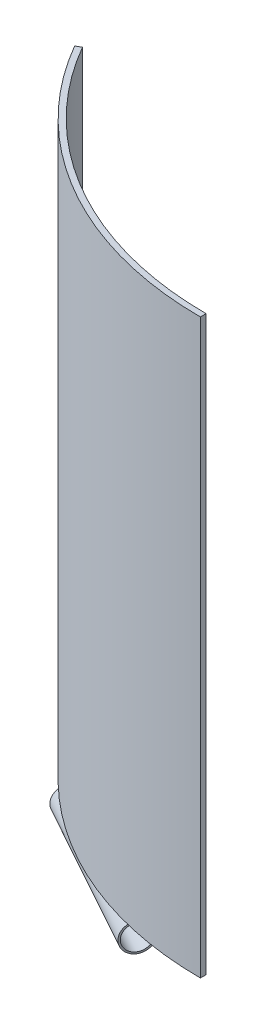
ISO-10303-21;
HEADER;
FILE_DESCRIPTION(('STEP AP214'),'2;1');
FILE_NAME('part.step','',(''),(''),'','','');
FILE_SCHEMA(('AUTOMOTIVE_DESIGN { 1 0 10303 214 1 1 1 1 }'));
ENDSEC;
DATA;
#1=APPLICATION_CONTEXT('core data for automotive mechanical design processes');
#2=APPLICATION_PROTOCOL_DEFINITION('international standard','automotive_design',2000,#1);
#3=PRODUCT_CONTEXT('',#1,'mechanical');
#4=PRODUCT('Part','Part','',(#3));
#5=PRODUCT_RELATED_PRODUCT_CATEGORY('part','',(#4));
#6=PRODUCT_DEFINITION_FORMATION('','',#4);
#7=PRODUCT_DEFINITION_CONTEXT('part definition',#1,'design');
#8=PRODUCT_DEFINITION('design','',#6,#7);
#9=PRODUCT_DEFINITION_SHAPE('','',#8);
#10=(LENGTH_UNIT() NAMED_UNIT(*) SI_UNIT(.MILLI.,.METRE.));
#11=(NAMED_UNIT(*) PLANE_ANGLE_UNIT() SI_UNIT($,.RADIAN.));
#12=(NAMED_UNIT(*) SI_UNIT($,.STERADIAN.) SOLID_ANGLE_UNIT());
#13=UNCERTAINTY_MEASURE_WITH_UNIT(LENGTH_MEASURE(1.E-05),#10,'distance_accuracy_value','');
#14=(GEOMETRIC_REPRESENTATION_CONTEXT(3) GLOBAL_UNCERTAINTY_ASSIGNED_CONTEXT((#13)) GLOBAL_UNIT_ASSIGNED_CONTEXT((#10,
#11,#12)) REPRESENTATION_CONTEXT('',''));
#15=CARTESIAN_POINT('',(0.,0.,0.));
#16=DIRECTION('',(0.,0.,1.));
#17=DIRECTION('',(1.,0.,0.));
#18=AXIS2_PLACEMENT_3D('',#15,#16,#17);
#19=CARTESIAN_POINT('',(-18.0124008718876,-3.175,72.1702526452258));
#20=DIRECTION('',(-0.875062045820491,0.,-0.484010760174252));
#21=DIRECTION('',(-0.484010760174252,0.,0.875062045820491));
#22=AXIS2_PLACEMENT_3D('',#19,#20,#21);
#23=CYLINDRICAL_SURFACE('',#22,3.175);
#24=CARTESIAN_POINT('',(-18.0124008718876,-3.175,72.1702526452258));
#25=DIRECTION('',(0.875062045820491,0.,0.484010760174252));
#26=DIRECTION('',(0.484010760174252,0.,-0.875062045820491));
#27=AXIS2_PLACEMENT_3D('',#24,#25,#26);
#28=CIRCLE('',#27,3.175);
#29=CARTESIAN_POINT('',(-16.4756667083344,-3.175,69.3919306497457));
#30=VERTEX_POINT('',#29);
#31=EDGE_CURVE('E11',#30,#30,#28,.T.);
#32=ORIENTED_EDGE('',*,*,#31,.F.);
#33=EDGE_LOOP('',(#32));
#34=FACE_BOUND('',#33,.T.);
#35=CARTESIAN_POINT('',(-51.7967963369251,-3.175,53.4835652164183));
#36=DIRECTION('',(0.875062045820491,0.,0.484010760174252));
#37=DIRECTION('',(0.484010760174252,0.,-0.875062045820491));
#38=AXIS2_PLACEMENT_3D('',#35,#36,#37);
#39=CIRCLE('',#38,3.175);
#40=CARTESIAN_POINT('',(-50.2600621733719,-3.175,50.7052432209382));
#41=VERTEX_POINT('',#40);
#42=EDGE_CURVE('E60',#41,#41,#39,.T.);
#43=ORIENTED_EDGE('',*,*,#42,.T.);
#44=EDGE_LOOP('',(#43));
#45=FACE_BOUND('',#44,.T.);
#46=ADVANCED_FACE('F54',(#34,#45),#23,.T.);
#47=CARTESIAN_POINT('',(-18.0124008718876,-3.175,72.1702526452258));
#48=DIRECTION('',(0.875062045820491,0.,0.484010760174252));
#49=DIRECTION('',(0.484010760174252,0.,-0.875062045820491));
#50=AXIS2_PLACEMENT_3D('',#47,#48,#49);
#51=PLANE('',#50);
#52=CARTESIAN_POINT('',(-18.0124008718876,-3.175,72.1702526452258));
#53=DIRECTION('',(0.875062045820491,0.,0.484010760174252));
#54=DIRECTION('',(0.484010760174252,0.,-0.875062045820491));
#55=AXIS2_PLACEMENT_3D('',#52,#53,#54);
#56=CIRCLE('',#55,2.79400000000002);
#57=CARTESIAN_POINT('',(-16.6600748079607,-3.175,69.7253292892033));
#58=VERTEX_POINT('',#57);
#59=EDGE_CURVE('E64',#58,#58,#56,.T.);
#60=ORIENTED_EDGE('',*,*,#59,.F.);
#61=EDGE_LOOP('',(#60));
#62=FACE_BOUND('',#61,.T.);
#63=ORIENTED_EDGE('',*,*,#31,.T.);
#64=EDGE_LOOP('',(#63));
#65=FACE_BOUND('',#64,.T.);
#66=ADVANCED_FACE('F79',(#62,#65),#51,.T.);
#67=CARTESIAN_POINT('',(-51.7967963369251,-3.175,53.4835652164183));
#68=DIRECTION('',(0.875062045820491,0.,0.484010760174252));
#69=DIRECTION('',(0.484010760174252,0.,-0.875062045820491));
#70=AXIS2_PLACEMENT_3D('',#67,#68,#69);
#71=PLANE('',#70);
#72=CARTESIAN_POINT('',(-51.7967963369251,-3.175,53.4835652164182));
#73=DIRECTION('',(-0.875062045820491,0.,-0.484010760174252));
#74=DIRECTION('',(-0.484010760174252,0.,0.875062045820491));
#75=AXIS2_PLACEMENT_3D('',#72,#73,#74);
#76=CIRCLE('',#75,2.79400000000002);
#77=CARTESIAN_POINT('',(-53.149122400852,-3.175,55.9284885724407));
#78=VERTEX_POINT('',#77);
#79=EDGE_CURVE('E68',#78,#78,#76,.T.);
#80=ORIENTED_EDGE('',*,*,#79,.F.);
#81=EDGE_LOOP('',(#80));
#82=FACE_BOUND('',#81,.T.);
#83=ORIENTED_EDGE('',*,*,#42,.F.);
#84=EDGE_LOOP('',(#83));
#85=FACE_BOUND('',#84,.T.);
#86=ADVANCED_FACE('F76',(#82,#85),#71,.F.);
#87=CARTESIAN_POINT('',(-14.0116171983963,-3.175,74.3831498407425));
#88=DIRECTION('',(-0.875062045820491,0.,-0.484010760174252));
#89=DIRECTION('',(-0.484010760174252,0.,0.875062045820491));
#90=AXIS2_PLACEMENT_3D('',#87,#88,#89);
#91=CYLINDRICAL_SURFACE('',#90,2.79400000000002);
#92=ORIENTED_EDGE('',*,*,#59,.T.);
#93=EDGE_LOOP('',(#92));
#94=FACE_BOUND('',#93,.T.);
#95=ORIENTED_EDGE('',*,*,#79,.T.);
#96=EDGE_LOOP('',(#95));
#97=FACE_BOUND('',#96,.T.);
#98=ADVANCED_FACE('F74',(#94,#97),#91,.F.);
#99=CLOSED_SHELL('',(#46,#66,#86,#98));
#100=MANIFOLD_SOLID_BREP('B2',#99);
#101=CARTESIAN_POINT('',(0.,25.4,0.));
#102=DIRECTION('',(0.,-1.,0.));
#103=DIRECTION('',(0.,0.,-1.));
#104=AXIS2_PLACEMENT_3D('',#101,#102,#103);
#105=CYLINDRICAL_SURFACE('',#104,71.12);
#106=DIRECTION('',(0.,-1.,0.));
#107=VECTOR('',#106,1.);
#108=CARTESIAN_POINT('',(-49.3573665216638,25.4,51.2045385688235));
#109=LINE('',#108,#107);
#110=CARTESIAN_POINT('',(-49.3573665216638,6.35,51.2045385688235));
#111=VERTEX_POINT('',#110);
#112=CARTESIAN_POINT('',(-49.3573665216638,0.,51.2045385688235));
#113=VERTEX_POINT('',#112);
#114=EDGE_CURVE('E195',#111,#113,#109,.T.);
#115=ORIENTED_EDGE('',*,*,#114,.F.);
#116=CARTESIAN_POINT('',(-49.3573665216638,6.35,51.2045385688235));
#117=CARTESIAN_POINT('',(-49.3573652597534,6.61771881219116,51.2045367891355));
#118=CARTESIAN_POINT('',(-49.3533029948045,6.8854078913629,51.2084558700492));
#119=CARTESIAN_POINT('',(-49.3370553186476,7.42030407676832,51.2241110994516));
#120=CARTESIAN_POINT('',(-49.324870102378,7.68751119441404,51.2358470603472));
#121=CARTESIAN_POINT('',(-49.2761363077966,8.4876591517723,51.2827355972177));
#122=CARTESIAN_POINT('',(-49.2274095832751,9.01926351451726,51.329568852524));
#123=CARTESIAN_POINT('',(-49.0975842620489,10.0746048855446,51.4537624096006));
#124=CARTESIAN_POINT('',(-49.016503112022,10.5983459763078,51.5311062586975));
#125=CARTESIAN_POINT('',(-48.8707528105034,11.3753416973957,51.6692201848417));
#126=CARTESIAN_POINT('',(-48.8181453332973,11.6329145215676,51.718943641989));
#127=CARTESIAN_POINT('',(-48.7048914111563,12.1448493310039,51.825611522175));
#128=CARTESIAN_POINT('',(-48.6442428935718,12.3992104698512,51.8825578067969));
#129=CARTESIAN_POINT('',(-48.4502480766987,13.1568632053012,52.0639928733405));
#130=CARTESIAN_POINT('',(-48.304869102134,13.6546354517401,52.1990620469349));
#131=CARTESIAN_POINT('',(-47.9823743262475,14.6316727443776,52.4956577484358));
#132=CARTESIAN_POINT('',(-47.8052586651772,15.1109378723519,52.6571841594214));
#133=CARTESIAN_POINT('',(-47.5161705812211,15.8132665488478,52.9177164706716));
#134=CARTESIAN_POINT('',(-47.4158982827076,16.0446288917426,53.0076073648309));
#135=CARTESIAN_POINT('',(-47.207629914459,16.5014004255731,53.1931718767468));
#136=CARTESIAN_POINT('',(-47.0996358263075,16.7268111236471,53.2888440099393));
#137=CARTESIAN_POINT('',(-46.7641188005348,17.3936255921992,53.5841431133983));
#138=CARTESIAN_POINT('',(-46.5250409215741,17.8256608665121,53.7920710701712));
#139=CARTESIAN_POINT('',(-46.0177236597758,18.6600750223687,54.2266973216519));
#140=CARTESIAN_POINT('',(-45.7495741583235,19.0625392016036,54.4533372735829));
#141=CARTESIAN_POINT('',(-45.1844597727074,19.8364124210124,54.9231641928396));
#142=CARTESIAN_POINT('',(-44.8874948971022,20.2078214704099,55.1663511552507));
#143=CARTESIAN_POINT('',(-44.2659673024639,20.9169026288164,55.6663054862512));
#144=CARTESIAN_POINT('',(-43.9414035562595,21.2545734811434,55.9230733601587));
#145=CARTESIAN_POINT('',(-43.2661882379939,21.8937655989848,56.4470896434286));
#146=CARTESIAN_POINT('',(-42.91553696729,22.1952872819814,56.7143379317067));
#147=CARTESIAN_POINT('',(-42.1944141079172,22.7566285805899,57.2528233900256));
#148=CARTESIAN_POINT('',(-41.8242393439033,23.0169154959907,57.5239710705038));
#149=CARTESIAN_POINT('',(-41.0622259046606,23.4985482722169,58.0703690963133));
#150=CARTESIAN_POINT('',(-40.6703874567389,23.7198945415268,58.3456193985756));
#151=CARTESIAN_POINT('',(-39.867395917458,24.122359181542,58.8972185455002));
#152=CARTESIAN_POINT('',(-39.4562452333284,24.3034825499111,59.173567249339));
#153=CARTESIAN_POINT('',(-38.6171261082675,24.6246845306415,59.7245668292002));
#154=CARTESIAN_POINT('',(-38.1891576232063,24.7647630352931,59.9992177007653));
#155=CARTESIAN_POINT('',(-37.3201455027519,25.0031637126344,60.5435661680649));
#156=CARTESIAN_POINT('',(-36.8791341640675,25.101581074304,60.8132736935948));
#157=CARTESIAN_POINT('',(-35.9859646458794,25.2570894844094,61.3460279392192));
#158=CARTESIAN_POINT('',(-35.5338065287228,25.3141807639401,61.6090746965526));
#159=CARTESIAN_POINT('',(-34.6212499607361,25.3873695055246,62.1264725361366));
#160=CARTESIAN_POINT('',(-34.1608509471373,25.4034641570908,62.3808230210427));
#161=CARTESIAN_POINT('',(-33.2348008314919,25.395295565324,62.8790816625221));
#162=CARTESIAN_POINT('',(-32.7691495828241,25.371031192547,63.1229895266637));
#163=CARTESIAN_POINT('',(-31.8180367364146,25.2813848717686,63.6078802219447));
#164=CARTESIAN_POINT('',(-31.3324867505585,25.2144959745294,63.8484108212909));
#165=CARTESIAN_POINT('',(-30.3621318918661,25.0394440661332,64.3155140193914));
#166=CARTESIAN_POINT('',(-29.8773270355771,24.9312801512981,64.5420863124155));
#167=CARTESIAN_POINT('',(-28.9113593669887,24.674957648434,64.9805292848114));
#168=CARTESIAN_POINT('',(-28.4301985513847,24.5267785644608,65.1923923599542));
#169=CARTESIAN_POINT('',(-27.4748315562922,24.1918651116405,65.6007466369491));
#170=CARTESIAN_POINT('',(-27.0006256048801,24.0051294813914,65.7972373355941));
#171=CARTESIAN_POINT('',(-26.0281412148589,23.5796355239507,66.1882498468881));
#172=CARTESIAN_POINT('',(-25.5306092197533,23.338087552931,66.3815966879089));
#173=CARTESIAN_POINT('',(-24.5506476954266,22.8139900870095,66.7502376185596));
#174=CARTESIAN_POINT('',(-24.0682193623018,22.5314373547745,66.925530280939));
#175=CARTESIAN_POINT('',(-23.122460158976,21.9271761674338,67.2581399862353));
#176=CARTESIAN_POINT('',(-22.6591189641452,21.60548926322,67.4154668310728));
#177=CARTESIAN_POINT('',(-21.7550710063113,20.9244519445069,67.7126106705241));
#178=CARTESIAN_POINT('',(-21.3143623094836,20.5651047558801,67.8524291626054));
#179=CARTESIAN_POINT('',(-20.5314600397134,19.8738413018054,68.0929656305183));
#180=CARTESIAN_POINT('',(-20.1851603848944,19.5474699510449,68.1963053176427));
#181=CARTESIAN_POINT('',(-19.5134566707862,18.8707898887676,68.3915323688647));
#182=CARTESIAN_POINT('',(-19.1880480728731,18.5204864109221,68.4834222245706));
#183=CARTESIAN_POINT('',(-18.5605261837878,17.7968093512954,68.6561517195612));
#184=CARTESIAN_POINT('',(-18.2584198008984,17.4234289866787,68.7369880873247));
#185=CARTESIAN_POINT('',(-17.6802043724938,16.6547325871741,68.8879838209757));
#186=CARTESIAN_POINT('',(-17.4041080803343,16.2594059409373,68.9581379593996));
#187=CARTESIAN_POINT('',(-17.1424639872496,15.8538097624071,69.023114450493));
#188=B_SPLINE_CURVE_WITH_KNOTS('',3,(#116,#117,#118,#119,#120,#121,#122,#123,#124,#125,#126,
#127,#128,#129,#130,#131,#132,#133,#134,#135,#136,#137,#138,#139,#140,#141,#142,#143,#144,#145,
#146,#147,#148,#149,#150,#151,#152,#153,#154,#155,#156,#157,#158,#159,#160,#161,#162,#163,#164,
#165,#166,#167,#168,#169,#170,#171,#172,#173,#174,#175,#176,#177,#178,#179,#180,#181,#182,#183,
#184,#185,#186,#187),.UNSPECIFIED.,.F.,.F.,(4,2,2,2,2,2,2,2,2,2,2,2,2,2,2,2,2,2,2,2,2,2,2,2,2,2,
2,2,2,2,2,2,2,2,2,4),(0.,0.803037585384164,1.60605589978929,3.21168310578875,4.81644566694522,
5.61889181597041,6.42154520620336,8.02712584734719,9.63269939323942,10.4355890131522,
11.238273328075,12.8434739909355,14.4438461897658,16.0442179132727,17.6446492253007,
19.2450620523656,20.8257906617084,22.4065026883384,23.9870182027175,25.5675378646422,
27.1444265435826,28.721306404519,30.2982943641565,31.8753264564213,33.5114636209979,
35.1476366093224,36.7846492473836,38.4217154498414,40.1774379460169,41.9332991322855,
43.6881977193716,45.4429461095222,46.9026882221883,48.3621121222156,49.8219670399777,
51.2825340732286),.UNSPECIFIED.);
#189=CARTESIAN_POINT('',(-34.4228452635928,25.3891523351977,62.2344126987533));
#190=VERTEX_POINT('',#189);
#191=EDGE_CURVE('E223',#111,#190,#188,.T.);
#192=ORIENTED_EDGE('',*,*,#191,.T.);
#193=CARTESIAN_POINT('',(-49.3573665216638,15.8538097624073,51.2045385688235));
#194=CARTESIAN_POINT('',(-49.1220348464051,16.3455845134195,51.4313979030367));
#195=CARTESIAN_POINT('',(-48.8689822632921,16.8222185699394,51.6721786856272));
#196=CARTESIAN_POINT('',(-48.3296043491767,17.7428270232079,52.1770021549655));
#197=CARTESIAN_POINT('',(-48.0432987301324,18.1868205164982,52.4410310383192));
#198=CARTESIAN_POINT('',(-47.4397833741944,19.0396736148463,52.9876113312744));
#199=CARTESIAN_POINT('',(-47.1226236807349,19.4485881532959,53.2701325117534));
#200=CARTESIAN_POINT('',(-46.4587872345089,20.2304156790268,53.8500669424058));
#201=CARTESIAN_POINT('',(-46.1121058284715,20.603322970934,54.1474825372118));
#202=CARTESIAN_POINT('',(-45.3917574361727,21.3106913958299,54.7527498251932));
#203=CARTESIAN_POINT('',(-45.0181471056079,21.6452296181641,55.0605789243974));
#204=CARTESIAN_POINT('',(-44.2450379133439,22.2751228808109,55.6837274767687));
#205=CARTESIAN_POINT('',(-43.8455388588784,22.570477629315,55.9990469856981));
#206=CARTESIAN_POINT('',(-43.0222154753056,23.1204907867591,56.6340336655559));
#207=CARTESIAN_POINT('',(-42.5983773731945,23.3751258385399,56.9537032184516));
#208=CARTESIAN_POINT('',(-41.7285383273601,23.8417670145723,57.5940548933133));
#209=CARTESIAN_POINT('',(-41.2825366157438,24.0537716605405,57.9147370500015));
#210=CARTESIAN_POINT('',(-40.3529142459724,24.4407180028111,58.566468391526));
#211=CARTESIAN_POINT('',(-39.8685056065112,24.61390610502,58.8974380270927));
#212=CARTESIAN_POINT('',(-38.8810286919337,24.9103586589151,59.5539378525337));
#213=CARTESIAN_POINT('',(-38.3779598415686,25.0336215701309,59.8794678742685));
#214=CARTESIAN_POINT('',(-37.356709134658,25.2282827279063,60.521850702976));
#215=CARTESIAN_POINT('',(-36.8385329537241,25.2997001974294,60.8387066840859));
#216=CARTESIAN_POINT('',(-35.7907873795517,25.3890572072093,61.4609230289271));
#217=CARTESIAN_POINT('',(-35.2612187865759,25.4070004914975,61.7662841959975));
#218=CARTESIAN_POINT('',(-34.2241016807465,25.3886129928538,62.3466036621565));
#219=CARTESIAN_POINT('',(-33.7169211168198,25.3551796436685,62.6223123096598));
#220=CARTESIAN_POINT('',(-32.7004789092278,25.238608530625,63.1590319898167));
#221=CARTESIAN_POINT('',(-32.1912173268848,25.1554722210425,63.4200434522557));
#222=CARTESIAN_POINT('',(-31.1753055422593,24.9393075052687,63.9255547421498));
#223=CARTESIAN_POINT('',(-30.6686544974504,24.8062963707171,64.1700602510634));
#224=CARTESIAN_POINT('',(-29.6625691414109,24.4907111875008,64.6412787461068));
#225=CARTESIAN_POINT('',(-29.1631344394462,24.3081398329825,64.8679926985412));
#226=CARTESIAN_POINT('',(-28.2106403118764,23.9087352536194,65.2875640370276));
#227=CARTESIAN_POINT('',(-27.7567668988568,23.6951565308815,65.4816790280873));
#228=CARTESIAN_POINT('',(-26.8635021011404,23.2271081387573,65.8531747403246));
#229=CARTESIAN_POINT('',(-26.4241099855863,22.9726405368144,66.0305563068665));
#230=CARTESIAN_POINT('',(-25.5637463485102,22.424477971972,66.368387774179));
#231=CARTESIAN_POINT('',(-25.1427728980054,22.1307871300326,66.52883945051));
#232=CARTESIAN_POINT('',(-24.3229477856515,21.5061811268914,66.8329244747342));
#233=CARTESIAN_POINT('',(-23.9240960799415,21.1752660394985,66.9765578559738));
#234=CARTESIAN_POINT('',(-23.1611748474643,20.4868070115378,67.2441370906602));
#235=CARTESIAN_POINT('',(-22.7965069609339,20.1300748785515,67.3684672844508));
#236=CARTESIAN_POINT('',(-22.0947181350669,19.3858663829899,67.601883198097));
#237=CARTESIAN_POINT('',(-21.7575967391085,18.9983905302452,67.7109691706684));
#238=CARTESIAN_POINT('',(-21.1136686725999,18.195343359829,67.9145159052618));
#239=CARTESIAN_POINT('',(-20.806865842219,17.7797684943171,68.0089748154674));
#240=CARTESIAN_POINT('',(-20.2261610949377,16.9234638394843,68.1839335916176));
#241=CARTESIAN_POINT('',(-19.9522590427855,16.4827341535835,68.2644335149468));
#242=CARTESIAN_POINT('',(-19.4370694997141,15.5747052268208,68.4129179543814));
#243=CARTESIAN_POINT('',(-19.1961306713216,15.1071866441386,68.4807710738696));
#244=CARTESIAN_POINT('',(-18.7520892310695,14.1528608678235,68.6036926929827));
#245=CARTESIAN_POINT('',(-18.5489894950116,13.6660522115362,68.6587602209707));
#246=CARTESIAN_POINT('',(-18.1824315902222,12.6768285273353,68.7567421978716));
#247=CARTESIAN_POINT('',(-18.0189525332701,12.1744218810631,68.799663052582));
#248=CARTESIAN_POINT('',(-17.732897980824,11.1574662592318,68.8739465640259));
#249=CARTESIAN_POINT('',(-17.6103111531603,10.6429206900376,68.9053124231642));
#250=CARTESIAN_POINT('',(-17.3869805049607,9.50277031673198,68.9620430536867));
#251=CARTESIAN_POINT('',(-17.2952791489143,8.87523223626952,68.9850130655464));
#252=CARTESIAN_POINT('',(-17.2035997612933,7.9300320097593,69.0079080807862));
#253=CARTESIAN_POINT('',(-17.1806854399629,7.6145504517821,69.0136131281824));
#254=CARTESIAN_POINT('',(-17.1501162329874,6.98273281605173,69.021214565586));
#255=CARTESIAN_POINT('',(-17.1424647370855,6.66639656409569,69.0231101095358));
#256=CARTESIAN_POINT('',(-17.1424639872496,6.35,69.023114450493));
#257=B_SPLINE_CURVE_WITH_KNOTS('',3,(#193,#194,#195,#196,#197,#198,#199,#200,#201,#202,#203,
#204,#205,#206,#207,#208,#209,#210,#211,#212,#213,#214,#215,#216,#217,#218,#219,#220,#221,#222,
#223,#224,#225,#226,#227,#228,#229,#230,#231,#232,#233,#234,#235,#236,#237,#238,#239,#240,#241,
#242,#243,#244,#245,#246,#247,#248,#249,#250,#251,#252,#253,#254,#255,#256),.UNSPECIFIED.,.F.,
.F.,(4,2,2,2,2,2,2,2,2,2,2,2,2,2,2,2,2,2,2,2,2,2,2,2,2,2,2,2,2,2,2,4),(0.,1.77058929703553,
3.54013431824873,5.306855636135,7.07385594542077,8.83724147279899,10.6006401317773,
12.365046690606,14.1295144227543,15.9623244882917,17.7951911019293,19.6273777879329,
21.4594361891229,23.1918997628961,24.9243126484147,26.6561261530093,28.3878455332234,
29.9994591707267,31.6109913466663,33.2223543411936,34.8337141407408,36.4070817004496,
37.9804231740766,39.5539636734181,41.1274977038689,42.7165655825886,44.3057541825399,
45.8941031228239,47.4820115289956,49.3823284016655,50.3310888257954,51.2800599380771),.UNSPECIFIED.);
#258=CARTESIAN_POINT('',(-17.1424639872496,6.35,69.023114450493));
#259=VERTEX_POINT('',#258);
#260=EDGE_CURVE('E216',#190,#259,#257,.T.);
#261=ORIENTED_EDGE('',*,*,#260,.T.);
#262=DIRECTION('',(0.,-1.,0.));
#263=VECTOR('',#262,1.);
#264=CARTESIAN_POINT('',(-17.1424639872496,25.4,69.023114450493));
#265=LINE('',#264,#263);
#266=CARTESIAN_POINT('',(-17.1424639872496,0.,69.023114450493));
#267=VERTEX_POINT('',#266);
#268=EDGE_CURVE('E202',#259,#267,#265,.T.);
#269=ORIENTED_EDGE('',*,*,#268,.T.);
#270=CARTESIAN_POINT('',(0.,0.,0.));
#271=DIRECTION('',(0.,1.,0.));
#272=DIRECTION('',(1.,0.,0.));
#273=AXIS2_PLACEMENT_3D('',#270,#271,#272);
#274=CIRCLE('',#273,71.12);
#275=EDGE_CURVE('E186',#267,#113,#274,.F.);
#276=ORIENTED_EDGE('',*,*,#275,.T.);
#277=EDGE_LOOP('',(#115,#192,#261,#269,#276));
#278=FACE_BOUND('',#277,.T.);
#279=ADVANCED_FACE('F125',(#278),#105,.F.);
#280=CARTESIAN_POINT('',(-52.001511156753,25.4,53.9476388492962));
#281=DIRECTION('',(-0.719973826895723,0.,-0.694001216558824));
#282=DIRECTION('',(-0.694001216558824,0.,0.719973826895723));
#283=AXIS2_PLACEMENT_3D('',#280,#281,#282);
#284=PLANE('',#283);
#285=DIRECTION('',(0.,-1.,0.));
#286=VECTOR('',#285,1.);
#287=CARTESIAN_POINT('',(-52.001511156753,25.4,53.9476388492962));
#288=LINE('',#287,#286);
#289=CARTESIAN_POINT('',(-52.001511156753,6.35,53.9476388492962));
#290=VERTEX_POINT('',#289);
#291=CARTESIAN_POINT('',(-52.001511156753,0.,53.9476388492962));
#292=VERTEX_POINT('',#291);
#293=EDGE_CURVE('E200',#290,#292,#288,.T.);
#294=ORIENTED_EDGE('',*,*,#293,.F.);
#295=DIRECTION('',(0.694001216558824,0.,-0.719973826895723));
#296=VECTOR('',#295,1.);
#297=CARTESIAN_POINT('',(-52.001511156753,6.35,53.9476388492962));
#298=LINE('',#297,#296);
#299=EDGE_CURVE('E198',#290,#111,#298,.T.);
#300=ORIENTED_EDGE('',*,*,#299,.T.);
#301=ORIENTED_EDGE('',*,*,#114,.T.);
#302=DIRECTION('',(0.694001216558824,0.,-0.719973826895723));
#303=VECTOR('',#302,1.);
#304=CARTESIAN_POINT('',(-52.001511156753,0.,53.9476388492962));
#305=LINE('',#304,#303);
#306=EDGE_CURVE('E181',#292,#113,#305,.T.);
#307=ORIENTED_EDGE('',*,*,#306,.F.);
#308=EDGE_LOOP('',(#294,#300,#301,#307));
#309=FACE_BOUND('',#308,.T.);
#310=ADVANCED_FACE('F196',(#309),#284,.T.);
#311=CARTESIAN_POINT('',(0.,25.4,0.));
#312=DIRECTION('',(0.,-1.,0.));
#313=DIRECTION('',(0.,0.,-1.));
#314=AXIS2_PLACEMENT_3D('',#311,#312,#313);
#315=CYLINDRICAL_SURFACE('',#314,74.93);
#316=CARTESIAN_POINT('',(0.,25.4,0.));
#317=DIRECTION('',(0.,-1.,0.));
#318=DIRECTION('',(0.,0.,-1.));
#319=AXIS2_PLACEMENT_3D('',#316,#317,#318);
#320=CIRCLE('',#319,74.93);
#321=CARTESIAN_POINT('',(-35.9557000913447,25.4,65.7395811588519));
#322=VERTEX_POINT('',#321);
#323=CARTESIAN_POINT('',(-36.5773374646575,25.4,65.3957436229344));
#324=VERTEX_POINT('',#323);
#325=EDGE_CURVE('E206',#322,#324,#320,.T.);
#326=ORIENTED_EDGE('',*,*,#325,.T.);
#327=CARTESIAN_POINT('',(-36.5773374646575,25.4,65.3957436229344));
#328=CARTESIAN_POINT('',(-36.8104604098553,25.3999997505894,65.2653545619273));
#329=CARTESIAN_POINT('',(-37.0428594018116,25.3947442951098,65.133729482635));
#330=CARTESIAN_POINT('',(-37.5058827815714,25.3736470465261,64.8682114216219));
#331=CARTESIAN_POINT('',(-37.7365071177319,25.357804946517,64.7343183742627));
#332=CARTESIAN_POINT('',(-38.4251751103359,25.2942882573758,64.3295741921919));
#333=CARTESIAN_POINT('',(-38.8800470836061,25.2306233005935,64.0556393678687));
#334=CARTESIAN_POINT('',(-39.7778780141632,25.0604586806587,63.5019963081696));
#335=CARTESIAN_POINT('',(-40.2208401784145,24.9539706742754,63.222289663569));
#336=CARTESIAN_POINT('',(-41.0920646283753,24.6983291304559,62.6595243998512));
#337=CARTESIAN_POINT('',(-41.520328036998,24.5491788603703,62.3764660390209));
#338=CARTESIAN_POINT('',(-42.3600154903678,24.2085293397743,61.8093124158499));
#339=CARTESIAN_POINT('',(-42.7714128670813,24.0169658723526,61.5252162305983));
#340=CARTESIAN_POINT('',(-43.5740990326327,23.5926241659147,60.9593631040211));
#341=CARTESIAN_POINT('',(-43.9653871540361,23.3598445600565,60.6776062405984));
#342=CARTESIAN_POINT('',(-44.7253056590159,22.8546350404243,60.1196644585236));
#343=CARTESIAN_POINT('',(-45.0939476124577,22.5822256170983,59.8434767438835));
#344=CARTESIAN_POINT('',(-45.8067390597188,21.9994885462581,59.2996504709516));
#345=CARTESIAN_POINT('',(-46.1508890655047,21.6891616917182,59.0320117340211));
#346=CARTESIAN_POINT('',(-46.8074610240377,21.0381990943804,58.5127235615672));
#347=CARTESIAN_POINT('',(-47.1203141164893,20.6981505697698,58.2608827034781));
#348=CARTESIAN_POINT('',(-47.7192479606945,19.9858312918676,57.7713415491433));
#349=CARTESIAN_POINT('',(-48.0053288599357,19.6135607161085,57.5336411750005));
#350=CARTESIAN_POINT('',(-48.549658769296,18.839275200064,57.0750581640133));
#351=CARTESIAN_POINT('',(-48.8078990350306,18.437250981021,56.854180817422));
#352=CARTESIAN_POINT('',(-49.2955239524803,17.6063742898653,56.4319083468646));
#353=CARTESIAN_POINT('',(-49.52490870304,17.1775219096602,56.2305131561629));
#354=CARTESIAN_POINT('',(-49.9555574546299,16.2929799986197,55.8482825964778));
#355=CARTESIAN_POINT('',(-50.1566198838942,15.8371279775121,55.6675961558144));
#356=CARTESIAN_POINT('',(-50.5281996604767,14.9044360525574,55.3305421768789));
#357=CARTESIAN_POINT('',(-50.6987154185853,14.4275950583526,55.1741759039346));
#358=CARTESIAN_POINT('',(-51.0086978261882,13.4564746636392,54.8877234575055));
#359=CARTESIAN_POINT('',(-51.1481758399906,12.962201722794,54.757627666841));
#360=CARTESIAN_POINT('',(-51.395826451358,11.9595427830022,54.5252492813077));
#361=CARTESIAN_POINT('',(-51.5040048967223,11.4511594398246,54.4229614911963));
#362=CARTESIAN_POINT('',(-51.6638934037104,10.5625407728852,54.2711303715926));
#363=CARTESIAN_POINT('',(-51.7229638818976,10.1847544318133,54.214802610712));
#364=CARTESIAN_POINT('',(-51.8242522718457,9.42496616620806,54.1179884860439));
#365=CARTESIAN_POINT('',(-51.8664731967955,9.04296500797385,54.0774992898874));
#366=CARTESIAN_POINT('',(-51.9339900349937,8.27654892141767,54.0126641506183));
#367=CARTESIAN_POINT('',(-51.9593049195966,7.89213718897537,53.9883001127056));
#368=CARTESIAN_POINT('',(-51.9930683690627,7.12181853572657,53.9557765543372));
#369=CARTESIAN_POINT('',(-52.0015137925458,6.73591134984423,53.9476200520013));
#370=CARTESIAN_POINT('',(-52.001511156753,6.35000000000001,53.9476388492962));
#371=B_SPLINE_CURVE_WITH_KNOTS('',3,(#327,#328,#329,#330,#331,#332,#333,#334,#335,#336,#337,
#338,#339,#340,#341,#342,#343,#344,#345,#346,#347,#348,#349,#350,#351,#352,#353,#354,#355,#356,
#357,#358,#359,#360,#361,#362,#363,#364,#365,#366,#367,#368,#369,#370),.UNSPECIFIED.,.F.,.F.,(4,
2,2,2,2,2,2,2,2,2,2,2,2,2,2,2,2,2,2,2,2,4),(0.,0.801214894988651,1.60245301805939,
3.20481503051308,4.80674116240882,6.40854464132412,8.01279016640773,9.61708890271284,
11.2205610712269,12.8239997117641,14.400877470038,15.9777465408035,17.5551094517073,
19.1324669592022,20.7205375671537,22.3086907714922,23.8962615215206,25.4835354687644,
26.6423777563594,27.8010127163733,28.9583453030729,30.1158933846634),.UNSPECIFIED.);
#372=EDGE_CURVE('E135',#324,#290,#371,.T.);
#373=ORIENTED_EDGE('',*,*,#372,.T.);
#374=ORIENTED_EDGE('',*,*,#293,.T.);
#375=CARTESIAN_POINT('',(0.,0.,0.));
#376=DIRECTION('',(0.,-1.,0.));
#377=DIRECTION('',(0.,0.,-1.));
#378=AXIS2_PLACEMENT_3D('',#375,#376,#377);
#379=CIRCLE('',#378,74.93);
#380=CARTESIAN_POINT('',(-18.0608102722808,0.,72.7207812960551));
#381=VERTEX_POINT('',#380);
#382=EDGE_CURVE('E189',#381,#292,#379,.T.);
#383=ORIENTED_EDGE('',*,*,#382,.F.);
#384=DIRECTION('',(0.,-1.,0.));
#385=VECTOR('',#384,1.);
#386=CARTESIAN_POINT('',(-18.0608102722808,25.4,72.7207812960551));
#387=LINE('',#386,#385);
#388=CARTESIAN_POINT('',(-18.0608102722808,6.35,72.7207812960551));
#389=VERTEX_POINT('',#388);
#390=EDGE_CURVE('E212',#389,#381,#387,.T.);
#391=ORIENTED_EDGE('',*,*,#390,.F.);
#392=CARTESIAN_POINT('',(-18.0608102722808,6.35,72.7207812960551));
#393=CARTESIAN_POINT('',(-18.0608094620943,6.61775000619587,72.720779386735));
#394=CARTESIAN_POINT('',(-18.0662894403766,6.88547026580001,72.7194207552887));
#395=CARTESIAN_POINT('',(-18.0881909165068,7.42042865459062,72.7139768881776));
#396=CARTESIAN_POINT('',(-18.1046121521665,7.68766679517638,72.7098917178496));
#397=CARTESIAN_POINT('',(-18.1702468757191,8.48790706876222,72.6935293493413));
#398=CARTESIAN_POINT('',(-18.2358314015563,9.01957226915851,72.677145305783));
#399=CARTESIAN_POINT('',(-18.4100705654318,10.074977565973,72.6332034965429));
#400=CARTESIAN_POINT('',(-18.5186974936933,10.5987225365,72.6056529193758));
#401=CARTESIAN_POINT('',(-18.7131911333832,11.3757233772257,72.5556736112301));
#402=CARTESIAN_POINT('',(-18.7832846926152,11.6332977933499,72.5375706946903));
#403=CARTESIAN_POINT('',(-18.9338658433141,12.145235544532,72.49841158369));
#404=CARTESIAN_POINT('',(-19.0143561122823,12.3995980338222,72.4773546283447));
#405=CARTESIAN_POINT('',(-19.2712168824668,13.1572576052453,72.4096443627578));
#406=CARTESIAN_POINT('',(-19.4629543609186,13.6550350707591,72.3584574851713));
#407=CARTESIAN_POINT('',(-19.8857466480009,14.6320836464576,72.2434074024505));
#408=CARTESIAN_POINT('',(-20.1168013017223,15.1113548295478,72.1795442472602));
#409=CARTESIAN_POINT('',(-20.4913308673183,15.8137115587183,72.0737611449987));
#410=CARTESIAN_POINT('',(-20.6208461745386,16.0450941866936,72.0368312372778));
#411=CARTESIAN_POINT('',(-20.888897839014,16.501906795576,71.9595602172571));
#412=CARTESIAN_POINT('',(-21.0274318807653,16.7273382836734,71.9192199797504));
#413=CARTESIAN_POINT('',(-21.4562108752538,17.3942164598401,71.7929295081453));
#414=CARTESIAN_POINT('',(-21.7596589291597,17.8262960049465,71.7017021762691));
#415=CARTESIAN_POINT('',(-22.3981602701538,18.6609398501862,71.5048151495112));
#416=CARTESIAN_POINT('',(-22.733126292516,19.0635804613697,71.3991949606551));
#417=CARTESIAN_POINT('',(-23.4325450070034,19.8378013569172,71.172718098924));
#418=CARTESIAN_POINT('',(-23.7969977808031,20.2093815552421,71.0518613838453));
#419=CARTESIAN_POINT('',(-24.5522296107621,20.9187689753437,70.7944350452253));
#420=CARTESIAN_POINT('',(-24.9430073161972,21.2565779277068,70.657866227613));
#421=CARTESIAN_POINT('',(-25.7475253825625,21.8960431580712,70.3686897635328));
#422=CARTESIAN_POINT('',(-26.1612652188709,22.1977002615461,70.2160824834286));
#423=CARTESIAN_POINT('',(-27.0034389006012,22.7596566432461,69.8964931890071));
#424=CARTESIAN_POINT('',(-27.4316597130708,23.0203763040435,69.729688757541));
#425=CARTESIAN_POINT('',(-28.3034555287412,23.5027658508967,69.3803990469728));
#426=CARTESIAN_POINT('',(-28.7470311496156,23.7244341638556,69.1979131366176));
#427=CARTESIAN_POINT('',(-29.6457564916506,24.1273931411389,68.8176727639682));
#428=CARTESIAN_POINT('',(-30.1009052392842,24.3086871892936,68.6199195831202));
#429=CARTESIAN_POINT('',(-31.0190386098606,24.6300047306923,68.2097996445928));
#430=CARTESIAN_POINT('',(-31.4820217167075,24.770036114604,67.9974356905279));
#431=CARTESIAN_POINT('',(-32.2805172443075,24.9746484744425,67.6210705743344));
#432=CARTESIAN_POINT('',(-32.6150377845198,25.0493673305432,67.4603834086129));
#433=CARTESIAN_POINT('',(-33.2848989134071,25.1773097891207,67.1324022198201));
#434=CARTESIAN_POINT('',(-33.6202393568245,25.2305369557081,66.9651092972813));
#435=CARTESIAN_POINT('',(-34.289945993253,25.3154740725042,66.6246594969852));
#436=CARTESIAN_POINT('',(-34.6243128793437,25.3472196117605,66.4515128195422));
#437=CARTESIAN_POINT('',(-35.2914840585623,25.3894906853945,66.0996129344724));
#438=CARTESIAN_POINT('',(-35.624288172472,25.4000138425577,65.9208591010401));
#439=CARTESIAN_POINT('',(-35.9557000913447,25.4,65.7395811588519));
#440=B_SPLINE_CURVE_WITH_KNOTS('',3,(#392,#393,#394,#395,#396,#397,#398,#399,#400,#401,#402,
#403,#404,#405,#406,#407,#408,#409,#410,#411,#412,#413,#414,#415,#416,#417,#418,#419,#420,#421,
#422,#423,#424,#425,#426,#427,#428,#429,#430,#431,#432,#433,#434,#435,#436,#437,#438,#439),
.UNSPECIFIED.,.F.,.F.,(4,2,2,2,2,2,2,2,2,2,2,2,2,2,2,2,2,2,2,2,2,2,2,4),(0.,0.80313111952684,
1.60624299409443,3.2120564327341,4.81683775832436,5.61929330315351,6.42195592077234,
8.0275644417883,9.63316663687307,10.4361265334405,11.238881081937,12.8442221576215,
14.4452424089702,16.0462670950897,17.6472096955975,19.2481157339964,20.8313219912385,
22.4145920098539,23.9977292821506,25.5805636140188,26.7156178348985,27.8504837447612,
28.9834648656557,30.1165728898066),.UNSPECIFIED.);
#441=EDGE_CURVE('E245',#389,#322,#440,.T.);
#442=ORIENTED_EDGE('',*,*,#441,.T.);
#443=EDGE_LOOP('',(#326,#373,#374,#383,#391,#442));
#444=FACE_BOUND('',#443,.T.);
#445=ADVANCED_FACE('F251',(#444),#315,.T.);
#446=CARTESIAN_POINT('',(-17.1424639872496,25.4,69.023114450493));
#447=DIRECTION('',(0.970516232431005,0.,0.241035770349398));
#448=DIRECTION('',(0.241035770349398,0.,-0.970516232431005));
#449=AXIS2_PLACEMENT_3D('',#446,#447,#448);
#450=PLANE('',#449);
#451=ORIENTED_EDGE('',*,*,#268,.F.);
#452=DIRECTION('',(-0.241035770349398,0.,0.970516232431005));
#453=VECTOR('',#452,1.);
#454=CARTESIAN_POINT('',(-17.1424639872496,6.35,69.023114450493));
#455=LINE('',#454,#453);
#456=EDGE_CURVE('E52',#259,#389,#455,.T.);
#457=ORIENTED_EDGE('',*,*,#456,.T.);
#458=ORIENTED_EDGE('',*,*,#390,.T.);
#459=DIRECTION('',(-0.241035770349398,0.,0.970516232431005));
#460=VECTOR('',#459,1.);
#461=CARTESIAN_POINT('',(-17.1424639872496,0.,69.023114450493));
#462=LINE('',#461,#460);
#463=EDGE_CURVE('E209',#267,#381,#462,.T.);
#464=ORIENTED_EDGE('',*,*,#463,.F.);
#465=EDGE_LOOP('',(#451,#457,#458,#464));
#466=FACE_BOUND('',#465,.T.);
#467=ADVANCED_FACE('F255',(#466),#450,.T.);
#468=CARTESIAN_POINT('',(0.,25.4,0.));
#469=DIRECTION('',(0.,1.,0.));
#470=DIRECTION('',(1.,0.,0.));
#471=AXIS2_PLACEMENT_3D('',#468,#469,#470);
#472=PLANE('',#471);
#473=DIRECTION('',(-0.241035770349398,0.,0.970516232431005));
#474=VECTOR('',#473,1.);
#475=CARTESIAN_POINT('',(-18.488334227811,25.4,-4.59173142515612));
#476=LINE('',#475,#474);
#477=CARTESIAN_POINT('',(-35.6249092012044,25.4,64.4076712603495));
#478=VERTEX_POINT('',#477);
#479=EDGE_CURVE('E148',#322,#478,#476,.F.);
#480=ORIENTED_EDGE('',*,*,#479,.T.);
#481=DIRECTION('',(0.694001216558824,0.,-0.719973826895723));
#482=VECTOR('',#481,1.);
#483=CARTESIAN_POINT('',(13.7155014023632,25.4,13.2207231754453));
#484=LINE('',#483,#482);
#485=EDGE_CURVE('E315',#478,#324,#484,.F.);
#486=ORIENTED_EDGE('',*,*,#485,.T.);
#487=ORIENTED_EDGE('',*,*,#325,.F.);
#488=EDGE_LOOP('',(#480,#486,#487));
#489=FACE_BOUND('',#488,.T.);
#490=ADVANCED_FACE('F260',(#489),#472,.T.);
#491=CARTESIAN_POINT('',(0.,0.,0.));
#492=DIRECTION('',(0.,1.,0.));
#493=DIRECTION('',(1.,0.,0.));
#494=AXIS2_PLACEMENT_3D('',#491,#492,#493);
#495=PLANE('',#494);
#496=ORIENTED_EDGE('',*,*,#275,.F.);
#497=ORIENTED_EDGE('',*,*,#463,.T.);
#498=ORIENTED_EDGE('',*,*,#382,.T.);
#499=ORIENTED_EDGE('',*,*,#306,.T.);
#500=EDGE_LOOP('',(#496,#497,#498,#499));
#501=FACE_BOUND('',#500,.T.);
#502=ADVANCED_FACE('F183',(#501),#495,.F.);
#503=CARTESIAN_POINT('',(-35.6307982150602,6.35,64.431383025337));
#504=DIRECTION('',(-0.241035770349398,0.,0.970516232431005));
#505=DIRECTION('',(0.970516232431005,0.,0.241035770349398));
#506=AXIS2_PLACEMENT_3D('',#503,#504,#505);
#507=CYLINDRICAL_SURFACE('',#506,19.05);
#508=ORIENTED_EDGE('',*,*,#456,.F.);
#509=ORIENTED_EDGE('',*,*,#260,.F.);
#510=CARTESIAN_POINT('',(-35.6249092012044,6.35,64.4076712603495));
#511=DIRECTION('',(0.875062045820493,0.,0.484010760174248));
#512=DIRECTION('',(0.484010760174248,0.,-0.875062045820493));
#513=AXIS2_PLACEMENT_3D('',#510,#511,#512);
#514=ELLIPSE('',#513,73.6035479632287,19.05);
#515=EDGE_CURVE('E130',#478,#190,#514,.F.);
#516=ORIENTED_EDGE('',*,*,#515,.F.);
#517=ORIENTED_EDGE('',*,*,#479,.F.);
#518=ORIENTED_EDGE('',*,*,#441,.F.);
#519=EDGE_LOOP('',(#508,#509,#516,#517,#518));
#520=FACE_BOUND('',#519,.T.);
#521=ADVANCED_FACE('F127',(#520),#507,.T.);
#522=CARTESIAN_POINT('',(-38.2860097543894,6.35,67.1683620247418));
#523=DIRECTION('',(0.694001216558824,0.,-0.719973826895723));
#524=DIRECTION('',(-0.719973826895723,0.,-0.694001216558824));
#525=AXIS2_PLACEMENT_3D('',#522,#523,#524);
#526=CYLINDRICAL_SURFACE('',#525,19.05);
#527=ORIENTED_EDGE('',*,*,#372,.F.);
#528=ORIENTED_EDGE('',*,*,#485,.F.);
#529=ORIENTED_EDGE('',*,*,#515,.T.);
#530=ORIENTED_EDGE('',*,*,#191,.F.);
#531=ORIENTED_EDGE('',*,*,#299,.F.);
#532=EDGE_LOOP('',(#527,#528,#529,#530,#531));
#533=FACE_BOUND('',#532,.T.);
#534=ADVANCED_FACE('F233',(#533),#526,.T.);
#535=CLOSED_SHELL('',(#279,#310,#445,#467,#490,#502,#521,#534));
#536=MANIFOLD_SOLID_BREP('B6',#535);
#537=CARTESIAN_POINT('',(0.,127.,0.));
#538=DIRECTION('',(0.,-1.,0.));
#539=DIRECTION('',(0.,0.,-1.));
#540=AXIS2_PLACEMENT_3D('',#537,#538,#539);
#541=CYLINDRICAL_SURFACE('',#540,74.93);
#542=CARTESIAN_POINT('',(0.,0.,0.));
#543=DIRECTION('',(0.,1.,0.));
#544=DIRECTION('',(1.,0.,0.));
#545=AXIS2_PLACEMENT_3D('',#542,#543,#544);
#546=CIRCLE('',#545,74.93);
#547=CARTESIAN_POINT('',(0.,0.,74.93));
#548=VERTEX_POINT('',#547);
#549=CARTESIAN_POINT('',(-64.8912835055681,0.,37.4649999999998));
#550=VERTEX_POINT('',#549);
#551=EDGE_CURVE('E384',#548,#550,#546,.F.);
#552=ORIENTED_EDGE('',*,*,#551,.T.);
#553=DIRECTION('',(0.,-1.,0.));
#554=VECTOR('',#553,1.);
#555=CARTESIAN_POINT('',(-64.8912835055681,127.,37.4649999999998));
#556=LINE('',#555,#554);
#557=CARTESIAN_POINT('',(-64.8912835055681,127.,37.4649999999998));
#558=VERTEX_POINT('',#557);
#559=EDGE_CURVE('E123',#558,#550,#556,.T.);
#560=ORIENTED_EDGE('',*,*,#559,.F.);
#561=CARTESIAN_POINT('',(0.,127.,0.));
#562=DIRECTION('',(0.,1.,0.));
#563=DIRECTION('',(1.,0.,0.));
#564=AXIS2_PLACEMENT_3D('',#561,#562,#563);
#565=CIRCLE('',#564,74.93);
#566=CARTESIAN_POINT('',(0.,127.,74.93));
#567=VERTEX_POINT('',#566);
#568=EDGE_CURVE('E361',#567,#558,#565,.F.);
#569=ORIENTED_EDGE('',*,*,#568,.F.);
#570=DIRECTION('',(0.,-1.,0.));
#571=VECTOR('',#570,1.);
#572=CARTESIAN_POINT('',(0.,127.,74.93));
#573=LINE('',#572,#571);
#574=EDGE_CURVE('E337',#567,#548,#573,.T.);
#575=ORIENTED_EDGE('',*,*,#574,.T.);
#576=EDGE_LOOP('',(#552,#560,#569,#575));
#577=FACE_BOUND('',#576,.T.);
#578=ADVANCED_FACE('F321',(#577),#541,.F.);
#579=CARTESIAN_POINT('',(-65.9911357683743,127.,38.0999999999999));
#580=DIRECTION('',(-0.500000000000012,0.,-0.866025403784432));
#581=DIRECTION('',(-0.866025403784432,0.,0.500000000000012));
#582=AXIS2_PLACEMENT_3D('',#579,#580,#581);
#583=PLANE('',#582);
#584=DIRECTION('',(0.866025403784432,0.,-0.500000000000012));
#585=VECTOR('',#584,1.);
#586=CARTESIAN_POINT('',(-65.9911357683743,0.,38.0999999999999));
#587=LINE('',#586,#585);
#588=CARTESIAN_POINT('',(-65.9911357683743,0.,38.0999999999999));
#589=VERTEX_POINT('',#588);
#590=EDGE_CURVE('E370',#589,#550,#587,.T.);
#591=ORIENTED_EDGE('',*,*,#590,.F.);
#592=DIRECTION('',(0.,-1.,0.));
#593=VECTOR('',#592,1.);
#594=CARTESIAN_POINT('',(-65.9911357683743,127.,38.0999999999999));
#595=LINE('',#594,#593);
#596=CARTESIAN_POINT('',(-65.9911357683743,127.,38.0999999999999));
#597=VERTEX_POINT('',#596);
#598=EDGE_CURVE('E329',#597,#589,#595,.T.);
#599=ORIENTED_EDGE('',*,*,#598,.F.);
#600=DIRECTION('',(0.866025403784432,0.,-0.500000000000012));
#601=VECTOR('',#600,1.);
#602=CARTESIAN_POINT('',(-65.9911357683743,127.,38.0999999999999));
#603=LINE('',#602,#601);
#604=EDGE_CURVE('E368',#597,#558,#603,.T.);
#605=ORIENTED_EDGE('',*,*,#604,.T.);
#606=ORIENTED_EDGE('',*,*,#559,.T.);
#607=EDGE_LOOP('',(#591,#599,#605,#606));
#608=FACE_BOUND('',#607,.T.);
#609=ADVANCED_FACE('F367',(#608),#583,.T.);
#610=CARTESIAN_POINT('',(0.,127.,0.));
#611=DIRECTION('',(0.,-1.,0.));
#612=DIRECTION('',(0.,0.,-1.));
#613=AXIS2_PLACEMENT_3D('',#610,#611,#612);
#614=CYLINDRICAL_SURFACE('',#613,76.2);
#615=CARTESIAN_POINT('',(0.,0.,0.));
#616=DIRECTION('',(0.,-1.,0.));
#617=DIRECTION('',(0.,0.,-1.));
#618=AXIS2_PLACEMENT_3D('',#615,#616,#617);
#619=CIRCLE('',#618,76.2);
#620=CARTESIAN_POINT('',(0.,0.,76.2));
#621=VERTEX_POINT('',#620);
#622=EDGE_CURVE('E387',#621,#589,#619,.T.);
#623=ORIENTED_EDGE('',*,*,#622,.F.);
#624=DIRECTION('',(0.,-1.,0.));
#625=VECTOR('',#624,1.);
#626=CARTESIAN_POINT('',(0.,127.,76.2));
#627=LINE('',#626,#625);
#628=CARTESIAN_POINT('',(0.,127.,76.2));
#629=VERTEX_POINT('',#628);
#630=EDGE_CURVE('E350',#629,#621,#627,.T.);
#631=ORIENTED_EDGE('',*,*,#630,.F.);
#632=CARTESIAN_POINT('',(0.,127.,0.));
#633=DIRECTION('',(0.,-1.,0.));
#634=DIRECTION('',(0.,0.,-1.));
#635=AXIS2_PLACEMENT_3D('',#632,#633,#634);
#636=CIRCLE('',#635,76.2);
#637=EDGE_CURVE('E376',#629,#597,#636,.T.);
#638=ORIENTED_EDGE('',*,*,#637,.T.);
#639=ORIENTED_EDGE('',*,*,#598,.T.);
#640=EDGE_LOOP('',(#623,#631,#638,#639));
#641=FACE_BOUND('',#640,.T.);
#642=ADVANCED_FACE('F378',(#641),#614,.T.);
#643=CARTESIAN_POINT('',(0.,127.,74.93));
#644=DIRECTION('',(1.,0.,0.));
#645=DIRECTION('',(0.,0.,-1.));
#646=AXIS2_PLACEMENT_3D('',#643,#644,#645);
#647=PLANE('',#646);
#648=DIRECTION('',(0.,0.,1.));
#649=VECTOR('',#648,1.);
#650=CARTESIAN_POINT('',(0.,0.,74.93));
#651=LINE('',#650,#649);
#652=EDGE_CURVE('E389',#548,#621,#651,.T.);
#653=ORIENTED_EDGE('',*,*,#652,.F.);
#654=ORIENTED_EDGE('',*,*,#574,.F.);
#655=DIRECTION('',(0.,0.,1.));
#656=VECTOR('',#655,1.);
#657=CARTESIAN_POINT('',(0.,127.,74.93));
#658=LINE('',#657,#656);
#659=EDGE_CURVE('E379',#567,#629,#658,.T.);
#660=ORIENTED_EDGE('',*,*,#659,.T.);
#661=ORIENTED_EDGE('',*,*,#630,.T.);
#662=EDGE_LOOP('',(#653,#654,#660,#661));
#663=FACE_BOUND('',#662,.T.);
#664=ADVANCED_FACE('F395',(#663),#647,.T.);
#665=CARTESIAN_POINT('',(0.,127.,0.));
#666=DIRECTION('',(0.,1.,0.));
#667=DIRECTION('',(1.,0.,0.));
#668=AXIS2_PLACEMENT_3D('',#665,#666,#667);
#669=PLANE('',#668);
#670=ORIENTED_EDGE('',*,*,#568,.T.);
#671=ORIENTED_EDGE('',*,*,#604,.F.);
#672=ORIENTED_EDGE('',*,*,#637,.F.);
#673=ORIENTED_EDGE('',*,*,#659,.F.);
#674=EDGE_LOOP('',(#670,#671,#672,#673));
#675=FACE_BOUND('',#674,.T.);
#676=ADVANCED_FACE('F375',(#675),#669,.T.);
#677=CARTESIAN_POINT('',(0.,0.,0.));
#678=DIRECTION('',(0.,1.,0.));
#679=DIRECTION('',(1.,0.,0.));
#680=AXIS2_PLACEMENT_3D('',#677,#678,#679);
#681=PLANE('',#680);
#682=ORIENTED_EDGE('',*,*,#551,.F.);
#683=ORIENTED_EDGE('',*,*,#652,.T.);
#684=ORIENTED_EDGE('',*,*,#622,.T.);
#685=ORIENTED_EDGE('',*,*,#590,.T.);
#686=EDGE_LOOP('',(#682,#683,#684,#685));
#687=FACE_BOUND('',#686,.T.);
#688=ADVANCED_FACE('F394',(#687),#681,.F.);
#689=CLOSED_SHELL('',(#578,#609,#642,#664,#676,#688));
#690=MANIFOLD_SOLID_BREP('B46_NOT_SHOWN',#689);
#691=ADVANCED_BREP_SHAPE_REPRESENTATION('',(#18,#100,#536,#690),#14);
#692=SHAPE_DEFINITION_REPRESENTATION(#9,#691);
ENDSEC;
END-ISO-10303-21;
